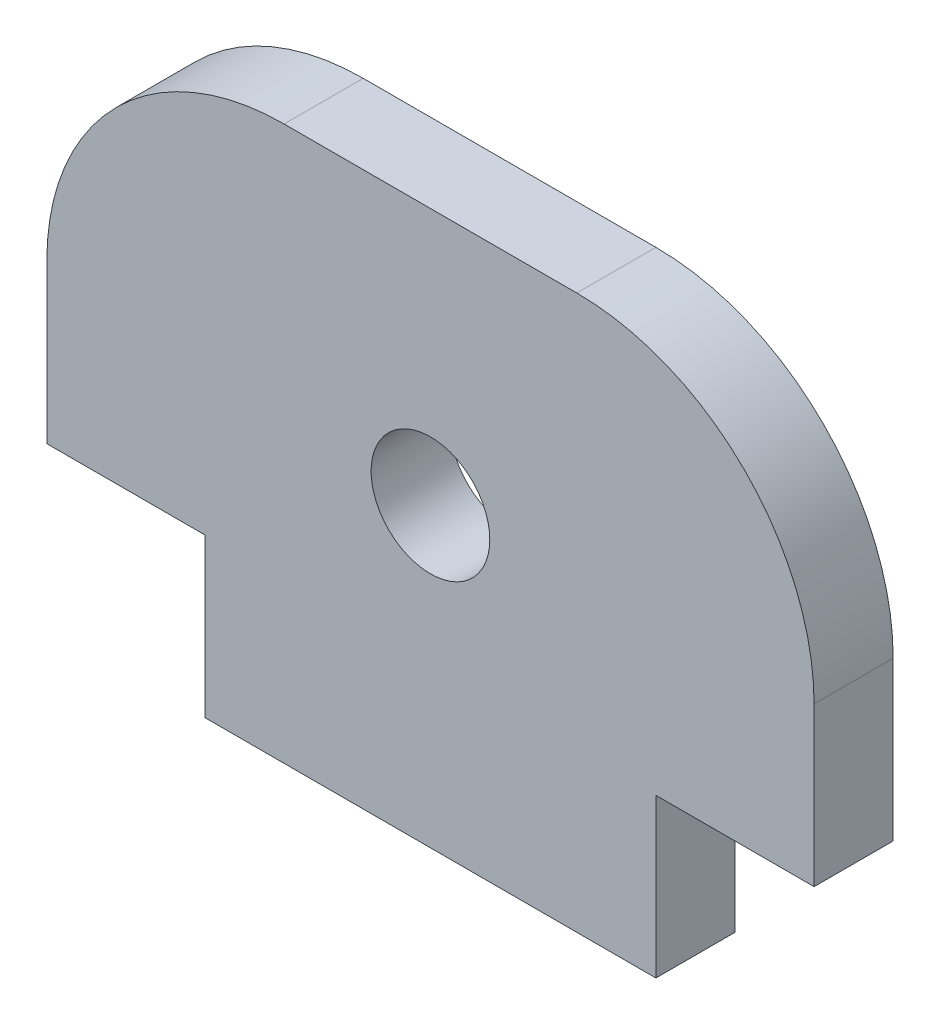
ISO-10303-21;
HEADER;
FILE_DESCRIPTION(('STEP AP214'),'2;1');
FILE_NAME('part.step','',(''),(''),'','','');
FILE_SCHEMA(('AUTOMOTIVE_DESIGN { 1 0 10303 214 1 1 1 1 }'));
ENDSEC;
DATA;
#1=APPLICATION_CONTEXT('core data for automotive mechanical design processes');
#2=APPLICATION_PROTOCOL_DEFINITION('international standard','automotive_design',2000,#1);
#3=PRODUCT_CONTEXT('',#1,'mechanical');
#4=PRODUCT('Part','Part','',(#3));
#5=PRODUCT_RELATED_PRODUCT_CATEGORY('part','',(#4));
#6=PRODUCT_DEFINITION_FORMATION('','',#4);
#7=PRODUCT_DEFINITION_CONTEXT('part definition',#1,'design');
#8=PRODUCT_DEFINITION('design','',#6,#7);
#9=PRODUCT_DEFINITION_SHAPE('','',#8);
#10=(LENGTH_UNIT() NAMED_UNIT(*) SI_UNIT(.MILLI.,.METRE.));
#11=(NAMED_UNIT(*) PLANE_ANGLE_UNIT() SI_UNIT($,.RADIAN.));
#12=(NAMED_UNIT(*) SI_UNIT($,.STERADIAN.) SOLID_ANGLE_UNIT());
#13=UNCERTAINTY_MEASURE_WITH_UNIT(LENGTH_MEASURE(1.E-05),#10,'distance_accuracy_value','');
#14=(GEOMETRIC_REPRESENTATION_CONTEXT(3) GLOBAL_UNCERTAINTY_ASSIGNED_CONTEXT((#13)) GLOBAL_UNIT_ASSIGNED_CONTEXT((#10,
#11,#12)) REPRESENTATION_CONTEXT('',''));
#15=CARTESIAN_POINT('',(0.,0.,0.));
#16=DIRECTION('',(0.,0.,1.));
#17=DIRECTION('',(1.,0.,0.));
#18=AXIS2_PLACEMENT_3D('',#15,#16,#17);
#19=CARTESIAN_POINT('',(2112.49445719507,1222.29862752324,2.));
#20=DIRECTION('',(0.,0.,1.));
#21=DIRECTION('',(1.,0.,0.));
#22=AXIS2_PLACEMENT_3D('',#19,#20,#21);
#23=PLANE('',#22);
#24=CARTESIAN_POINT('',(2112.49445719507,1222.29862752324,2.));
#25=DIRECTION('',(0.,0.,1.));
#26=DIRECTION('',(1.,0.,0.));
#27=AXIS2_PLACEMENT_3D('',#24,#25,#26);
#28=CIRCLE('',#27,6.00000000000012);
#29=CARTESIAN_POINT('',(2118.49445719507,1222.29862752324,2.));
#30=VERTEX_POINT('',#29);
#31=CARTESIAN_POINT('',(2112.49445719507,1228.29862752324,2.));
#32=VERTEX_POINT('',#31);
#33=EDGE_CURVE('E160',#30,#32,#28,.T.);
#34=ORIENTED_EDGE('',*,*,#33,.T.);
#35=DIRECTION('',(-1.,0.,0.));
#36=VECTOR('',#35,1.);
#37=CARTESIAN_POINT('',(2105.09445719507,1228.29862752324,2.));
#38=LINE('',#37,#36);
#39=CARTESIAN_POINT('',(2105.09445719507,1228.29862752324,2.));
#40=VERTEX_POINT('',#39);
#41=EDGE_CURVE('E98',#32,#40,#38,.T.);
#42=ORIENTED_EDGE('',*,*,#41,.T.);
#43=CARTESIAN_POINT('',(2105.09445719507,1222.29862752324,2.));
#44=DIRECTION('',(0.,0.,1.));
#45=DIRECTION('',(1.,0.,0.));
#46=AXIS2_PLACEMENT_3D('',#43,#44,#45);
#47=CIRCLE('',#46,5.99999999999989);
#48=CARTESIAN_POINT('',(2099.09445719507,1222.29862752324,2.));
#49=VERTEX_POINT('',#48);
#50=EDGE_CURVE('E181',#40,#49,#47,.T.);
#51=ORIENTED_EDGE('',*,*,#50,.T.);
#52=DIRECTION('',(0.,-1.,0.));
#53=VECTOR('',#52,1.);
#54=CARTESIAN_POINT('',(2099.09445719507,1218.29862752324,2.));
#55=LINE('',#54,#53);
#56=CARTESIAN_POINT('',(2099.09445719507,1218.29862752324,2.));
#57=VERTEX_POINT('',#56);
#58=EDGE_CURVE('E200',#49,#57,#55,.T.);
#59=ORIENTED_EDGE('',*,*,#58,.T.);
#60=DIRECTION('',(1.,0.,0.));
#61=VECTOR('',#60,1.);
#62=CARTESIAN_POINT('',(2099.09445719507,1218.29862752324,2.));
#63=LINE('',#62,#61);
#64=CARTESIAN_POINT('',(2103.09445719507,1218.29862752324,2.));
#65=VERTEX_POINT('',#64);
#66=EDGE_CURVE('E197',#57,#65,#63,.T.);
#67=ORIENTED_EDGE('',*,*,#66,.T.);
#68=DIRECTION('',(0.,-1.,0.));
#69=VECTOR('',#68,1.);
#70=CARTESIAN_POINT('',(2103.09445719507,1214.29862752324,2.));
#71=LINE('',#70,#69);
#72=CARTESIAN_POINT('',(2103.09445719507,1214.29862752324,2.));
#73=VERTEX_POINT('',#72);
#74=EDGE_CURVE('E199',#65,#73,#71,.T.);
#75=ORIENTED_EDGE('',*,*,#74,.T.);
#76=DIRECTION('',(1.,0.,0.));
#77=VECTOR('',#76,1.);
#78=CARTESIAN_POINT('',(2114.49445719507,1214.29862752324,2.));
#79=LINE('',#78,#77);
#80=CARTESIAN_POINT('',(2114.49445719507,1214.29862752324,2.));
#81=VERTEX_POINT('',#80);
#82=EDGE_CURVE('E123',#73,#81,#79,.T.);
#83=ORIENTED_EDGE('',*,*,#82,.T.);
#84=DIRECTION('',(0.,1.,0.));
#85=VECTOR('',#84,1.);
#86=CARTESIAN_POINT('',(2114.49445719507,1218.29862752324,2.));
#87=LINE('',#86,#85);
#88=CARTESIAN_POINT('',(2114.49445719507,1218.29862752324,2.));
#89=VERTEX_POINT('',#88);
#90=EDGE_CURVE('E117',#81,#89,#87,.T.);
#91=ORIENTED_EDGE('',*,*,#90,.T.);
#92=DIRECTION('',(1.,0.,0.));
#93=VECTOR('',#92,1.);
#94=CARTESIAN_POINT('',(2118.49445719507,1218.29862752324,2.));
#95=LINE('',#94,#93);
#96=CARTESIAN_POINT('',(2118.49445719507,1218.29862752324,2.));
#97=VERTEX_POINT('',#96);
#98=EDGE_CURVE('E121',#89,#97,#95,.T.);
#99=ORIENTED_EDGE('',*,*,#98,.T.);
#100=DIRECTION('',(0.,1.,0.));
#101=VECTOR('',#100,1.);
#102=CARTESIAN_POINT('',(2118.49445719507,1218.29862752324,2.));
#103=LINE('',#102,#101);
#104=EDGE_CURVE('E49',#97,#30,#103,.T.);
#105=ORIENTED_EDGE('',*,*,#104,.T.);
#106=EDGE_LOOP('',(#34,#42,#51,#59,#67,#75,#83,#91,#99,#105));
#107=FACE_BOUND('',#106,.T.);
#108=CARTESIAN_POINT('',(2108.79445719507,1221.79862752324,2.));
#109=DIRECTION('',(0.,0.,1.));
#110=DIRECTION('',(1.,0.,0.));
#111=AXIS2_PLACEMENT_3D('',#108,#109,#110);
#112=CIRCLE('',#111,1.50000000000006);
#113=CARTESIAN_POINT('',(2110.29445719507,1221.79862752324,2.));
#114=VERTEX_POINT('',#113);
#115=EDGE_CURVE('E145',#114,#114,#112,.T.);
#116=ORIENTED_EDGE('',*,*,#115,.F.);
#117=EDGE_LOOP('',(#116));
#118=FACE_BOUND('',#117,.T.);
#119=ADVANCED_FACE('F32',(#107,#118),#23,.T.);
#120=CARTESIAN_POINT('',(2112.49445719507,1222.29862752324,0.));
#121=DIRECTION('',(0.,0.,1.));
#122=DIRECTION('',(1.,0.,0.));
#123=AXIS2_PLACEMENT_3D('',#120,#121,#122);
#124=PLANE('',#123);
#125=CARTESIAN_POINT('',(2112.49445719507,1222.29862752324,0.));
#126=DIRECTION('',(0.,0.,1.));
#127=DIRECTION('',(1.,0.,0.));
#128=AXIS2_PLACEMENT_3D('',#125,#126,#127);
#129=CIRCLE('',#128,6.00000000000012);
#130=CARTESIAN_POINT('',(2118.49445719507,1222.29862752324,0.));
#131=VERTEX_POINT('',#130);
#132=CARTESIAN_POINT('',(2112.49445719507,1228.29862752324,0.));
#133=VERTEX_POINT('',#132);
#134=EDGE_CURVE('E141',#131,#133,#129,.T.);
#135=ORIENTED_EDGE('',*,*,#134,.F.);
#136=DIRECTION('',(0.,1.,0.));
#137=VECTOR('',#136,1.);
#138=CARTESIAN_POINT('',(2118.49445719507,1218.29862752324,0.));
#139=LINE('',#138,#137);
#140=CARTESIAN_POINT('',(2118.49445719507,1218.29862752324,0.));
#141=VERTEX_POINT('',#140);
#142=EDGE_CURVE('E90',#141,#131,#139,.T.);
#143=ORIENTED_EDGE('',*,*,#142,.F.);
#144=DIRECTION('',(1.,0.,0.));
#145=VECTOR('',#144,1.);
#146=CARTESIAN_POINT('',(2118.49445719507,1218.29862752324,0.));
#147=LINE('',#146,#145);
#148=CARTESIAN_POINT('',(2114.49445719507,1218.29862752324,0.));
#149=VERTEX_POINT('',#148);
#150=EDGE_CURVE('E84',#149,#141,#147,.T.);
#151=ORIENTED_EDGE('',*,*,#150,.F.);
#152=DIRECTION('',(0.,1.,0.));
#153=VECTOR('',#152,1.);
#154=CARTESIAN_POINT('',(2114.49445719507,1218.29862752324,0.));
#155=LINE('',#154,#153);
#156=CARTESIAN_POINT('',(2114.49445719507,1214.29862752324,0.));
#157=VERTEX_POINT('',#156);
#158=EDGE_CURVE('E131',#157,#149,#155,.T.);
#159=ORIENTED_EDGE('',*,*,#158,.F.);
#160=DIRECTION('',(1.,0.,0.));
#161=VECTOR('',#160,1.);
#162=CARTESIAN_POINT('',(2114.49445719507,1214.29862752324,0.));
#163=LINE('',#162,#161);
#164=CARTESIAN_POINT('',(2103.09445719507,1214.29862752324,0.));
#165=VERTEX_POINT('',#164);
#166=EDGE_CURVE('E155',#165,#157,#163,.T.);
#167=ORIENTED_EDGE('',*,*,#166,.F.);
#168=DIRECTION('',(0.,-1.,0.));
#169=VECTOR('',#168,1.);
#170=CARTESIAN_POINT('',(2103.09445719507,1214.29862752324,0.));
#171=LINE('',#170,#169);
#172=CARTESIAN_POINT('',(2103.09445719507,1218.29862752324,0.));
#173=VERTEX_POINT('',#172);
#174=EDGE_CURVE('E153',#173,#165,#171,.T.);
#175=ORIENTED_EDGE('',*,*,#174,.F.);
#176=DIRECTION('',(1.,0.,0.));
#177=VECTOR('',#176,1.);
#178=CARTESIAN_POINT('',(2099.09445719507,1218.29862752324,0.));
#179=LINE('',#178,#177);
#180=CARTESIAN_POINT('',(2099.09445719507,1218.29862752324,0.));
#181=VERTEX_POINT('',#180);
#182=EDGE_CURVE('E151',#181,#173,#179,.T.);
#183=ORIENTED_EDGE('',*,*,#182,.F.);
#184=DIRECTION('',(0.,-1.,0.));
#185=VECTOR('',#184,1.);
#186=CARTESIAN_POINT('',(2099.09445719507,1218.29862752324,0.));
#187=LINE('',#186,#185);
#188=CARTESIAN_POINT('',(2099.09445719507,1222.29862752324,0.));
#189=VERTEX_POINT('',#188);
#190=EDGE_CURVE('E149',#189,#181,#187,.T.);
#191=ORIENTED_EDGE('',*,*,#190,.F.);
#192=CARTESIAN_POINT('',(2105.09445719507,1222.29862752324,0.));
#193=DIRECTION('',(0.,0.,1.));
#194=DIRECTION('',(1.,0.,0.));
#195=AXIS2_PLACEMENT_3D('',#192,#193,#194);
#196=CIRCLE('',#195,5.99999999999989);
#197=CARTESIAN_POINT('',(2105.09445719507,1228.29862752324,0.));
#198=VERTEX_POINT('',#197);
#199=EDGE_CURVE('E147',#198,#189,#196,.T.);
#200=ORIENTED_EDGE('',*,*,#199,.F.);
#201=DIRECTION('',(-1.,0.,0.));
#202=VECTOR('',#201,1.);
#203=CARTESIAN_POINT('',(2105.09445719507,1228.29862752324,0.));
#204=LINE('',#203,#202);
#205=EDGE_CURVE('E144',#133,#198,#204,.T.);
#206=ORIENTED_EDGE('',*,*,#205,.F.);
#207=EDGE_LOOP('',(#135,#143,#151,#159,#167,#175,#183,#191,#200,#206));
#208=FACE_BOUND('',#207,.T.);
#209=CARTESIAN_POINT('',(2108.79445719507,1221.79862752324,0.));
#210=DIRECTION('',(0.,0.,1.));
#211=DIRECTION('',(1.,0.,0.));
#212=AXIS2_PLACEMENT_3D('',#209,#210,#211);
#213=CIRCLE('',#212,1.50000000000006);
#214=CARTESIAN_POINT('',(2110.29445719507,1221.79862752324,0.));
#215=VERTEX_POINT('',#214);
#216=EDGE_CURVE('E208',#215,#215,#213,.T.);
#217=ORIENTED_EDGE('',*,*,#216,.T.);
#218=EDGE_LOOP('',(#217));
#219=FACE_BOUND('',#218,.T.);
#220=ADVANCED_FACE('F185',(#208,#219),#124,.F.);
#221=CARTESIAN_POINT('',(2112.49445719507,1222.29862752324,2.));
#222=DIRECTION('',(0.,0.,-1.));
#223=DIRECTION('',(-1.,0.,0.));
#224=AXIS2_PLACEMENT_3D('',#221,#222,#223);
#225=CYLINDRICAL_SURFACE('',#224,6.00000000000012);
#226=ORIENTED_EDGE('',*,*,#134,.T.);
#227=DIRECTION('',(0.,0.,-1.));
#228=VECTOR('',#227,1.);
#229=CARTESIAN_POINT('',(2112.49445719507,1228.29862752324,2.));
#230=LINE('',#229,#228);
#231=EDGE_CURVE('E11',#32,#133,#230,.T.);
#232=ORIENTED_EDGE('',*,*,#231,.F.);
#233=ORIENTED_EDGE('',*,*,#33,.F.);
#234=DIRECTION('',(0.,0.,-1.));
#235=VECTOR('',#234,1.);
#236=CARTESIAN_POINT('',(2118.49445719507,1222.29862752324,2.));
#237=LINE('',#236,#235);
#238=EDGE_CURVE('E137',#30,#131,#237,.T.);
#239=ORIENTED_EDGE('',*,*,#238,.T.);
#240=EDGE_LOOP('',(#226,#232,#233,#239));
#241=FACE_BOUND('',#240,.T.);
#242=ADVANCED_FACE('F34',(#241),#225,.T.);
#243=CARTESIAN_POINT('',(2105.09445719507,1228.29862752324,2.));
#244=DIRECTION('',(0.,-1.,0.));
#245=DIRECTION('',(0.,0.,-1.));
#246=AXIS2_PLACEMENT_3D('',#243,#244,#245);
#247=PLANE('',#246);
#248=ORIENTED_EDGE('',*,*,#205,.T.);
#249=DIRECTION('',(0.,0.,-1.));
#250=VECTOR('',#249,1.);
#251=CARTESIAN_POINT('',(2105.09445719507,1228.29862752324,2.));
#252=LINE('',#251,#250);
#253=EDGE_CURVE('E41',#40,#198,#252,.T.);
#254=ORIENTED_EDGE('',*,*,#253,.F.);
#255=ORIENTED_EDGE('',*,*,#41,.F.);
#256=ORIENTED_EDGE('',*,*,#231,.T.);
#257=EDGE_LOOP('',(#248,#254,#255,#256));
#258=FACE_BOUND('',#257,.T.);
#259=ADVANCED_FACE('F244',(#258),#247,.F.);
#260=CARTESIAN_POINT('',(2105.09445719507,1222.29862752324,2.));
#261=DIRECTION('',(0.,0.,-1.));
#262=DIRECTION('',(-1.,0.,0.));
#263=AXIS2_PLACEMENT_3D('',#260,#261,#262);
#264=CYLINDRICAL_SURFACE('',#263,5.99999999999989);
#265=ORIENTED_EDGE('',*,*,#199,.T.);
#266=DIRECTION('',(0.,0.,-1.));
#267=VECTOR('',#266,1.);
#268=CARTESIAN_POINT('',(2099.09445719507,1222.29862752324,2.));
#269=LINE('',#268,#267);
#270=EDGE_CURVE('E173',#49,#189,#269,.T.);
#271=ORIENTED_EDGE('',*,*,#270,.F.);
#272=ORIENTED_EDGE('',*,*,#50,.F.);
#273=ORIENTED_EDGE('',*,*,#253,.T.);
#274=EDGE_LOOP('',(#265,#271,#272,#273));
#275=FACE_BOUND('',#274,.T.);
#276=ADVANCED_FACE('F179',(#275),#264,.T.);
#277=CARTESIAN_POINT('',(2099.09445719507,1218.29862752324,2.));
#278=DIRECTION('',(1.,0.,0.));
#279=DIRECTION('',(0.,0.,-1.));
#280=AXIS2_PLACEMENT_3D('',#277,#278,#279);
#281=PLANE('',#280);
#282=ORIENTED_EDGE('',*,*,#190,.T.);
#283=DIRECTION('',(0.,0.,-1.));
#284=VECTOR('',#283,1.);
#285=CARTESIAN_POINT('',(2099.09445719507,1218.29862752324,2.));
#286=LINE('',#285,#284);
#287=EDGE_CURVE('E170',#57,#181,#286,.T.);
#288=ORIENTED_EDGE('',*,*,#287,.F.);
#289=ORIENTED_EDGE('',*,*,#58,.F.);
#290=ORIENTED_EDGE('',*,*,#270,.T.);
#291=EDGE_LOOP('',(#282,#288,#289,#290));
#292=FACE_BOUND('',#291,.T.);
#293=ADVANCED_FACE('F191',(#292),#281,.F.);
#294=CARTESIAN_POINT('',(2099.09445719507,1218.29862752324,2.));
#295=DIRECTION('',(0.,1.,0.));
#296=DIRECTION('',(0.,0.,1.));
#297=AXIS2_PLACEMENT_3D('',#294,#295,#296);
#298=PLANE('',#297);
#299=ORIENTED_EDGE('',*,*,#182,.T.);
#300=DIRECTION('',(0.,0.,-1.));
#301=VECTOR('',#300,1.);
#302=CARTESIAN_POINT('',(2103.09445719507,1218.29862752324,2.));
#303=LINE('',#302,#301);
#304=EDGE_CURVE('E167',#65,#173,#303,.T.);
#305=ORIENTED_EDGE('',*,*,#304,.F.);
#306=ORIENTED_EDGE('',*,*,#66,.F.);
#307=ORIENTED_EDGE('',*,*,#287,.T.);
#308=EDGE_LOOP('',(#299,#305,#306,#307));
#309=FACE_BOUND('',#308,.T.);
#310=ADVANCED_FACE('F195',(#309),#298,.F.);
#311=CARTESIAN_POINT('',(2103.09445719507,1214.29862752324,2.));
#312=DIRECTION('',(1.,0.,0.));
#313=DIRECTION('',(0.,0.,-1.));
#314=AXIS2_PLACEMENT_3D('',#311,#312,#313);
#315=PLANE('',#314);
#316=ORIENTED_EDGE('',*,*,#174,.T.);
#317=DIRECTION('',(0.,0.,-1.));
#318=VECTOR('',#317,1.);
#319=CARTESIAN_POINT('',(2103.09445719507,1214.29862752324,2.));
#320=LINE('',#319,#318);
#321=EDGE_CURVE('E164',#73,#165,#320,.T.);
#322=ORIENTED_EDGE('',*,*,#321,.F.);
#323=ORIENTED_EDGE('',*,*,#74,.F.);
#324=ORIENTED_EDGE('',*,*,#304,.T.);
#325=EDGE_LOOP('',(#316,#322,#323,#324));
#326=FACE_BOUND('',#325,.T.);
#327=ADVANCED_FACE('F234',(#326),#315,.F.);
#328=CARTESIAN_POINT('',(2114.49445719507,1214.29862752324,2.));
#329=DIRECTION('',(0.,1.,0.));
#330=DIRECTION('',(-1.,0.,0.));
#331=AXIS2_PLACEMENT_3D('',#328,#329,#330);
#332=PLANE('',#331);
#333=ORIENTED_EDGE('',*,*,#166,.T.);
#334=DIRECTION('',(0.,0.,-1.));
#335=VECTOR('',#334,1.);
#336=CARTESIAN_POINT('',(2114.49445719507,1214.29862752324,2.));
#337=LINE('',#336,#335);
#338=EDGE_CURVE('E132',#81,#157,#337,.T.);
#339=ORIENTED_EDGE('',*,*,#338,.F.);
#340=ORIENTED_EDGE('',*,*,#82,.F.);
#341=ORIENTED_EDGE('',*,*,#321,.T.);
#342=EDGE_LOOP('',(#333,#339,#340,#341));
#343=FACE_BOUND('',#342,.T.);
#344=ADVANCED_FACE('F231',(#343),#332,.F.);
#345=CARTESIAN_POINT('',(2114.49445719507,1218.29862752324,2.));
#346=DIRECTION('',(-1.,0.,0.));
#347=DIRECTION('',(0.,0.,1.));
#348=AXIS2_PLACEMENT_3D('',#345,#346,#347);
#349=PLANE('',#348);
#350=ORIENTED_EDGE('',*,*,#158,.T.);
#351=DIRECTION('',(0.,0.,-1.));
#352=VECTOR('',#351,1.);
#353=CARTESIAN_POINT('',(2114.49445719507,1218.29862752324,2.));
#354=LINE('',#353,#352);
#355=EDGE_CURVE('E128',#89,#149,#354,.T.);
#356=ORIENTED_EDGE('',*,*,#355,.F.);
#357=ORIENTED_EDGE('',*,*,#90,.F.);
#358=ORIENTED_EDGE('',*,*,#338,.T.);
#359=EDGE_LOOP('',(#350,#356,#357,#358));
#360=FACE_BOUND('',#359,.T.);
#361=ADVANCED_FACE('F129',(#360),#349,.F.);
#362=CARTESIAN_POINT('',(2118.49445719507,1218.29862752324,2.));
#363=DIRECTION('',(0.,1.,0.));
#364=DIRECTION('',(0.,0.,1.));
#365=AXIS2_PLACEMENT_3D('',#362,#363,#364);
#366=PLANE('',#365);
#367=ORIENTED_EDGE('',*,*,#150,.T.);
#368=DIRECTION('',(0.,0.,-1.));
#369=VECTOR('',#368,1.);
#370=CARTESIAN_POINT('',(2118.49445719507,1218.29862752324,2.));
#371=LINE('',#370,#369);
#372=EDGE_CURVE('E133',#97,#141,#371,.T.);
#373=ORIENTED_EDGE('',*,*,#372,.F.);
#374=ORIENTED_EDGE('',*,*,#98,.F.);
#375=ORIENTED_EDGE('',*,*,#355,.T.);
#376=EDGE_LOOP('',(#367,#373,#374,#375));
#377=FACE_BOUND('',#376,.T.);
#378=ADVANCED_FACE('F135',(#377),#366,.F.);
#379=CARTESIAN_POINT('',(2118.49445719507,1218.29862752324,2.));
#380=DIRECTION('',(-1.,0.,0.));
#381=DIRECTION('',(0.,0.,1.));
#382=AXIS2_PLACEMENT_3D('',#379,#380,#381);
#383=PLANE('',#382);
#384=ORIENTED_EDGE('',*,*,#142,.T.);
#385=ORIENTED_EDGE('',*,*,#238,.F.);
#386=ORIENTED_EDGE('',*,*,#104,.F.);
#387=ORIENTED_EDGE('',*,*,#372,.T.);
#388=EDGE_LOOP('',(#384,#385,#386,#387));
#389=FACE_BOUND('',#388,.T.);
#390=ADVANCED_FACE('F224',(#389),#383,.F.);
#391=CARTESIAN_POINT('',(2108.79445719507,1221.79862752324,2.));
#392=DIRECTION('',(0.,0.,-1.));
#393=DIRECTION('',(-1.,0.,0.));
#394=AXIS2_PLACEMENT_3D('',#391,#392,#393);
#395=CYLINDRICAL_SURFACE('',#394,1.50000000000006);
#396=ORIENTED_EDGE('',*,*,#115,.T.);
#397=EDGE_LOOP('',(#396));
#398=FACE_BOUND('',#397,.T.);
#399=ORIENTED_EDGE('',*,*,#216,.F.);
#400=EDGE_LOOP('',(#399));
#401=FACE_BOUND('',#400,.T.);
#402=ADVANCED_FACE('F214',(#398,#401),#395,.F.);
#403=CLOSED_SHELL('',(#119,#220,#242,#259,#276,#293,#310,#327,#344,#361,#378,#390,#402));
#404=MANIFOLD_SOLID_BREP('B2',#403);
#405=ADVANCED_BREP_SHAPE_REPRESENTATION('',(#18,#404),#14);
#406=SHAPE_DEFINITION_REPRESENTATION(#9,#405);
ENDSEC;
END-ISO-10303-21;
